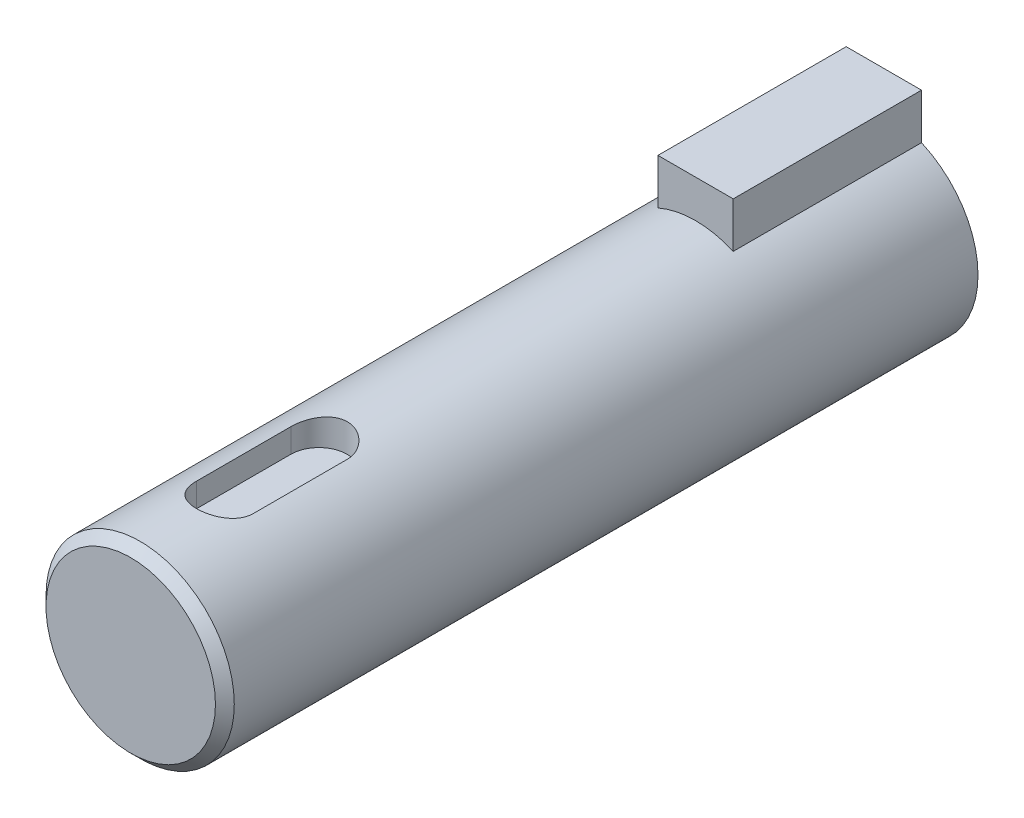
ISO-10303-21;
HEADER;
FILE_DESCRIPTION(('STEP AP214'),'2;1');
FILE_NAME('part.step','',(''),(''),'','','');
FILE_SCHEMA(('AUTOMOTIVE_DESIGN { 1 0 10303 214 1 1 1 1 }'));
ENDSEC;
DATA;
#1=APPLICATION_CONTEXT('core data for automotive mechanical design processes');
#2=APPLICATION_PROTOCOL_DEFINITION('international standard','automotive_design',2000,#1);
#3=PRODUCT_CONTEXT('',#1,'mechanical');
#4=PRODUCT('Part','Part','',(#3));
#5=PRODUCT_RELATED_PRODUCT_CATEGORY('part','',(#4));
#6=PRODUCT_DEFINITION_FORMATION('','',#4);
#7=PRODUCT_DEFINITION_CONTEXT('part definition',#1,'design');
#8=PRODUCT_DEFINITION('design','',#6,#7);
#9=PRODUCT_DEFINITION_SHAPE('','',#8);
#10=(LENGTH_UNIT() NAMED_UNIT(*) SI_UNIT(.MILLI.,.METRE.));
#11=(NAMED_UNIT(*) PLANE_ANGLE_UNIT() SI_UNIT($,.RADIAN.));
#12=(NAMED_UNIT(*) SI_UNIT($,.STERADIAN.) SOLID_ANGLE_UNIT());
#13=UNCERTAINTY_MEASURE_WITH_UNIT(LENGTH_MEASURE(1.E-05),#10,'distance_accuracy_value','');
#14=(GEOMETRIC_REPRESENTATION_CONTEXT(3) GLOBAL_UNCERTAINTY_ASSIGNED_CONTEXT((#13)) GLOBAL_UNIT_ASSIGNED_CONTEXT((#10,
#11,#12)) REPRESENTATION_CONTEXT('',''));
#15=CARTESIAN_POINT('',(0.,0.,0.));
#16=DIRECTION('',(0.,0.,1.));
#17=DIRECTION('',(1.,0.,0.));
#18=AXIS2_PLACEMENT_3D('',#15,#16,#17);
#19=CARTESIAN_POINT('',(0.,0.,10.));
#20=DIRECTION('',(0.,0.,-1.));
#21=DIRECTION('',(-1.,0.,0.));
#22=AXIS2_PLACEMENT_3D('',#19,#20,#21);
#23=CYLINDRICAL_SURFACE('',#22,5.);
#24=CARTESIAN_POINT('',(0.,0.,39.5));
#25=DIRECTION('',(0.,0.,1.));
#26=DIRECTION('',(1.,0.,0.));
#27=AXIS2_PLACEMENT_3D('',#24,#25,#26);
#28=CIRCLE('',#27,5.);
#29=CARTESIAN_POINT('',(5.,0.,39.5));
#30=VERTEX_POINT('',#29);
#31=EDGE_CURVE('E11',#30,#30,#28,.F.);
#32=ORIENTED_EDGE('',*,*,#31,.T.);
#33=EDGE_LOOP('',(#32));
#34=FACE_BOUND('',#33,.T.);
#35=CARTESIAN_POINT('',(0.,0.,0.));
#36=DIRECTION('',(0.,0.,1.));
#37=DIRECTION('',(1.,0.,0.));
#38=AXIS2_PLACEMENT_3D('',#35,#36,#37);
#39=CIRCLE('',#38,5.);
#40=CARTESIAN_POINT('',(-2.,4.58257569495584,0.));
#41=VERTEX_POINT('',#40);
#42=CARTESIAN_POINT('',(2.,4.58257569495584,0.));
#43=VERTEX_POINT('',#42);
#44=EDGE_CURVE('E172',#41,#43,#39,.T.);
#45=ORIENTED_EDGE('',*,*,#44,.T.);
#46=DIRECTION('',(0.,0.,-1.));
#47=VECTOR('',#46,1.);
#48=CARTESIAN_POINT('',(2.,4.58257569495584,10.));
#49=LINE('',#48,#47);
#50=CARTESIAN_POINT('',(2.,4.58257569495584,10.));
#51=VERTEX_POINT('',#50);
#52=EDGE_CURVE('E187',#51,#43,#49,.T.);
#53=ORIENTED_EDGE('',*,*,#52,.F.);
#54=CARTESIAN_POINT('',(0.,0.,10.));
#55=DIRECTION('',(0.,0.,1.));
#56=DIRECTION('',(1.,0.,0.));
#57=AXIS2_PLACEMENT_3D('',#54,#55,#56);
#58=CIRCLE('',#57,5.);
#59=CARTESIAN_POINT('',(-2.,4.58257569495584,10.));
#60=VERTEX_POINT('',#59);
#61=EDGE_CURVE('E126',#51,#60,#58,.T.);
#62=ORIENTED_EDGE('',*,*,#61,.T.);
#63=DIRECTION('',(0.,0.,-1.));
#64=VECTOR('',#63,1.);
#65=CARTESIAN_POINT('',(-2.,4.58257569495584,10.));
#66=LINE('',#65,#64);
#67=EDGE_CURVE('E89',#60,#41,#66,.T.);
#68=ORIENTED_EDGE('',*,*,#67,.T.);
#69=EDGE_LOOP('',(#45,#53,#62,#68));
#70=FACE_BOUND('',#69,.T.);
#71=CARTESIAN_POINT('',(-1.5,4.76969600708473,35.));
#72=CARTESIAN_POINT('',(-1.50000085357071,4.76969249084934,35.041179392908));
#73=CARTESIAN_POINT('',(-1.49830317083428,4.77022997000129,35.0823380431261));
#74=CARTESIAN_POINT('',(-1.49153785660317,4.77235095109998,35.1643411620956));
#75=CARTESIAN_POINT('',(-1.48647098275841,4.77393421787376,35.2051856993949));
#76=CARTESIAN_POINT('',(-1.46630203689311,4.78018490618873,35.3265905409547));
#77=CARTESIAN_POINT('',(-1.44623120413662,4.78635370384274,35.4063063904164));
#78=CARTESIAN_POINT('',(-1.39353102315626,4.80195952113208,35.5610355783859));
#79=CARTESIAN_POINT('',(-1.36090607068203,4.81139539670392,35.6360505521981));
#80=CARTESIAN_POINT('',(-1.28407841117656,4.83246571212051,35.7795966815976));
#81=CARTESIAN_POINT('',(-1.23987031651226,4.84410117434933,35.8481247997284));
#82=CARTESIAN_POINT('',(-1.13964850658326,4.86866835244721,35.9788660559971));
#83=CARTESIAN_POINT('',(-1.08333433465208,4.88162755412974,36.0408436603434));
#84=CARTESIAN_POINT('',(-0.961138919873354,4.90714811559049,36.1546355839));
#85=CARTESIAN_POINT('',(-0.895256063916348,4.91970940785249,36.2064481860031));
#86=CARTESIAN_POINT('',(-0.754109921315429,4.94333239727705,36.2994637703185));
#87=CARTESIAN_POINT('',(-0.678680819336258,4.95435770971354,36.340425180298));
#88=CARTESIAN_POINT('',(-0.521621185505772,4.97334469846208,36.4089884116182));
#89=CARTESIAN_POINT('',(-0.439992259012925,4.98130716463903,36.4365936777943));
#90=CARTESIAN_POINT('',(-0.275324697874875,4.99307639935002,36.4768797991021));
#91=CARTESIAN_POINT('',(-0.192393125294251,4.99699549276993,36.4899648579698));
#92=CARTESIAN_POINT('',(-0.0254235719980803,5.00063202022426,36.5021173413633));
#93=CARTESIAN_POINT('',(0.0586141962423634,5.00035024971471,36.5011874197002));
#94=CARTESIAN_POINT('',(0.222571599946018,4.99569602566266,36.485607091241));
#95=CARTESIAN_POINT('',(0.302537145464642,4.99145415509187,36.4713946550213));
#96=CARTESIAN_POINT('',(0.458890052102027,4.9795151369998,36.4303683647619));
#97=CARTESIAN_POINT('',(0.535277225531998,4.97181780846028,36.4035538505441));
#98=CARTESIAN_POINT('',(0.683347815892216,4.95365214926145,36.3377877783536));
#99=CARTESIAN_POINT('',(0.754966006044142,4.94315255692525,36.2986983556431));
#100=CARTESIAN_POINT('',(0.89076552957442,4.92049624651755,36.2096014099517));
#101=CARTESIAN_POINT('',(0.954945191614595,4.90833915735884,36.1595914405212));
#102=CARTESIAN_POINT('',(1.07665450541275,4.88311673571409,36.0478080119165));
#103=CARTESIAN_POINT('',(1.13383351478034,4.87003445449553,35.9856561362393));
#104=CARTESIAN_POINT('',(1.23706769492487,4.84484215114658,35.8525025765721));
#105=CARTESIAN_POINT('',(1.28311962013078,4.83273241337565,35.7814983196345));
#106=CARTESIAN_POINT('',(1.36316407240863,4.81077228795653,35.6317190715507));
#107=CARTESIAN_POINT('',(1.39703006341135,4.80094596245948,35.5528728204066));
#108=CARTESIAN_POINT('',(1.45085886004699,4.78495663653201,35.3902754960183));
#109=CARTESIAN_POINT('',(1.47084293218035,4.77878803475874,35.3065321392856));
#110=CARTESIAN_POINT('',(1.4890120359008,4.77314032325006,35.1850051109298));
#111=CARTESIAN_POINT('',(1.49313202989009,4.77185156275266,35.1481092658204));
#112=CARTESIAN_POINT('',(1.49862355614854,4.77012928611782,35.0741485209005));
#113=CARTESIAN_POINT('',(1.49999912968269,4.76969451246644,35.0370839503361));
#114=CARTESIAN_POINT('',(1.5,4.76969600708473,35.));
#115=B_SPLINE_CURVE_WITH_KNOTS('',3,(#71,#72,#73,#74,#75,#76,#77,#78,#79,#80,#81,#82,#83,#84,
#85,#86,#87,#88,#89,#90,#91,#92,#93,#94,#95,#96,#97,#98,#99,#100,#101,#102,#103,#104,#105,#106,
#107,#108,#109,#110,#111,#112,#113,#114),.UNSPECIFIED.,.F.,.F.,(4,2,2,2,2,2,2,2,2,2,2,2,2,2,2,2,
2,2,2,2,2,4),(0.,0.123459071219744,0.246890388853047,0.492911349615212,0.738846245884322,
0.984895736828089,1.23795510798803,1.49105719006936,1.74939356197455,2.00766326783256,
2.25854751319802,2.5093842528947,2.75223130012966,2.99509107067836,3.2407824256273,
3.48652887757005,3.74172568310981,3.99699683536778,4.25484698071527,4.51230123440207,
4.62365084745809,4.73483637253615),.UNSPECIFIED.);
#116=CARTESIAN_POINT('',(-1.5,4.76969600708473,35.));
#117=VERTEX_POINT('',#116);
#118=CARTESIAN_POINT('',(1.5,4.76969600708473,35.));
#119=VERTEX_POINT('',#118);
#120=EDGE_CURVE('E122',#117,#119,#115,.T.);
#121=ORIENTED_EDGE('',*,*,#120,.F.);
#122=DIRECTION('',(0.,0.,-1.));
#123=VECTOR('',#122,1.);
#124=CARTESIAN_POINT('',(-1.5,4.76969600708473,10.));
#125=LINE('',#124,#123);
#126=CARTESIAN_POINT('',(-1.5,4.76969600708473,30.));
#127=VERTEX_POINT('',#126);
#128=EDGE_CURVE('E193',#127,#117,#125,.F.);
#129=ORIENTED_EDGE('',*,*,#128,.F.);
#130=CARTESIAN_POINT('',(1.5,4.76969600708473,30.));
#131=CARTESIAN_POINT('',(1.50000085357071,4.76969249084934,29.958820607092));
#132=CARTESIAN_POINT('',(1.49830317083428,4.77022997000129,29.9176619568739));
#133=CARTESIAN_POINT('',(1.49153785660317,4.77235095109998,29.8356588379044));
#134=CARTESIAN_POINT('',(1.48647098275841,4.77393421787376,29.7948143006051));
#135=CARTESIAN_POINT('',(1.46630203689311,4.78018490618873,29.6734094590453));
#136=CARTESIAN_POINT('',(1.44623120413662,4.78635370384274,29.5936936095836));
#137=CARTESIAN_POINT('',(1.39353102315626,4.80195952113208,29.4389644216141));
#138=CARTESIAN_POINT('',(1.36090607068203,4.81139539670393,29.3639494478019));
#139=CARTESIAN_POINT('',(1.28407841117655,4.83246571212052,29.2204033184024));
#140=CARTESIAN_POINT('',(1.23987031651226,4.84410117434933,29.1518752002716));
#141=CARTESIAN_POINT('',(1.13964850658326,4.86866835244721,29.021133944003));
#142=CARTESIAN_POINT('',(1.08333433465208,4.88162755412974,28.9591563396566));
#143=CARTESIAN_POINT('',(0.961138919873354,4.90714811559049,28.8453644161));
#144=CARTESIAN_POINT('',(0.895256063916348,4.91970940785249,28.7935518139969));
#145=CARTESIAN_POINT('',(0.75410992131543,4.94333239727705,28.7005362296815));
#146=CARTESIAN_POINT('',(0.678680819336259,4.95435770971354,28.6595748197021));
#147=CARTESIAN_POINT('',(0.521621185505774,4.97334469846208,28.5910115883818));
#148=CARTESIAN_POINT('',(0.439992259012927,4.98130716463903,28.5634063222057));
#149=CARTESIAN_POINT('',(0.275324697874877,4.99307639935002,28.523120200898));
#150=CARTESIAN_POINT('',(0.192393125294253,4.99699549276993,28.5100351420303));
#151=CARTESIAN_POINT('',(0.0254235719980812,5.00063202022426,28.4978826586367));
#152=CARTESIAN_POINT('',(-0.058614196242363,5.00035024971471,28.4988125802998));
#153=CARTESIAN_POINT('',(-0.222571599946017,4.99569602566266,28.514392908759));
#154=CARTESIAN_POINT('',(-0.302537145464641,4.99145415509187,28.5286053449787));
#155=CARTESIAN_POINT('',(-0.458890052102026,4.9795151369998,28.5696316352381));
#156=CARTESIAN_POINT('',(-0.535277225531999,4.97181780846028,28.5964461494559));
#157=CARTESIAN_POINT('',(-0.683347815892217,4.95365214926145,28.6622122216464));
#158=CARTESIAN_POINT('',(-0.754966006044143,4.94315255692525,28.7013016443569));
#159=CARTESIAN_POINT('',(-0.890765529574421,4.92049624651755,28.7903985900483));
#160=CARTESIAN_POINT('',(-0.954945191614596,4.90833915735884,28.8404085594788));
#161=CARTESIAN_POINT('',(-1.07665450541275,4.88311673571409,28.9521919880835));
#162=CARTESIAN_POINT('',(-1.13383351478034,4.87003445449553,29.0143438637607));
#163=CARTESIAN_POINT('',(-1.23706769492487,4.84484215114658,29.1474974234279));
#164=CARTESIAN_POINT('',(-1.28311962013078,4.83273241337565,29.2185016803655));
#165=CARTESIAN_POINT('',(-1.36316407240863,4.81077228795653,29.3682809284493));
#166=CARTESIAN_POINT('',(-1.39703006341135,4.80094596245948,29.4471271795934));
#167=CARTESIAN_POINT('',(-1.45085886004699,4.78495663653201,29.6097245039817));
#168=CARTESIAN_POINT('',(-1.47084293218035,4.77878803475874,29.6934678607144));
#169=CARTESIAN_POINT('',(-1.4890120359008,4.77314032325006,29.8149948890702));
#170=CARTESIAN_POINT('',(-1.49313202989009,4.77185156275266,29.8518907341796));
#171=CARTESIAN_POINT('',(-1.49862355614854,4.77012928611782,29.9258514790995));
#172=CARTESIAN_POINT('',(-1.49999912968269,4.76969451246644,29.9629160496639));
#173=CARTESIAN_POINT('',(-1.5,4.76969600708473,30.));
#174=B_SPLINE_CURVE_WITH_KNOTS('',3,(#130,#131,#132,#133,#134,#135,#136,#137,#138,#139,#140,
#141,#142,#143,#144,#145,#146,#147,#148,#149,#150,#151,#152,#153,#154,#155,#156,#157,#158,#159,
#160,#161,#162,#163,#164,#165,#166,#167,#168,#169,#170,#171,#172,#173),.UNSPECIFIED.,.F.,.F.,(4,
2,2,2,2,2,2,2,2,2,2,2,2,2,2,2,2,2,2,2,2,4),(0.,0.123459071219737,0.246890388853047,
0.492911349615212,0.73884624588433,0.984895736828095,1.23795510798803,1.49105719006936,
1.74939356197455,2.00766326783256,2.25854751319802,2.5093842528947,2.75223130012966,
2.99509107067836,3.2407824256273,3.48652887757005,3.74172568310981,3.99699683536777,
4.25484698071527,4.51230123440207,4.62365084745809,4.73483637253615),.UNSPECIFIED.);
#175=CARTESIAN_POINT('',(1.5,4.76969600708473,30.));
#176=VERTEX_POINT('',#175);
#177=EDGE_CURVE('E196',#176,#127,#174,.T.);
#178=ORIENTED_EDGE('',*,*,#177,.F.);
#179=DIRECTION('',(0.,0.,-1.));
#180=VECTOR('',#179,1.);
#181=CARTESIAN_POINT('',(1.5,4.76969600708473,10.));
#182=LINE('',#181,#180);
#183=EDGE_CURVE('E205',#119,#176,#182,.T.);
#184=ORIENTED_EDGE('',*,*,#183,.F.);
#185=EDGE_LOOP('',(#121,#129,#178,#184));
#186=FACE_BOUND('',#185,.T.);
#187=ADVANCED_FACE('F43',(#34,#70,#186),#23,.T.);
#188=CARTESIAN_POINT('',(-2.,0.,10.));
#189=DIRECTION('',(-1.,0.,0.));
#190=DIRECTION('',(0.,0.,1.));
#191=AXIS2_PLACEMENT_3D('',#188,#189,#190);
#192=PLANE('',#191);
#193=DIRECTION('',(0.,1.,0.));
#194=VECTOR('',#193,1.);
#195=CARTESIAN_POINT('',(-2.,0.,0.));
#196=LINE('',#195,#194);
#197=CARTESIAN_POINT('',(-2.,7.,0.));
#198=VERTEX_POINT('',#197);
#199=EDGE_CURVE('E159',#41,#198,#196,.T.);
#200=ORIENTED_EDGE('',*,*,#199,.F.);
#201=ORIENTED_EDGE('',*,*,#67,.F.);
#202=DIRECTION('',(0.,1.,0.));
#203=VECTOR('',#202,1.);
#204=CARTESIAN_POINT('',(-2.,0.,10.));
#205=LINE('',#204,#203);
#206=CARTESIAN_POINT('',(-2.,7.,10.));
#207=VERTEX_POINT('',#206);
#208=EDGE_CURVE('E160',#60,#207,#205,.T.);
#209=ORIENTED_EDGE('',*,*,#208,.T.);
#210=DIRECTION('',(0.,0.,-1.));
#211=VECTOR('',#210,1.);
#212=CARTESIAN_POINT('',(-2.,7.,10.));
#213=LINE('',#212,#211);
#214=EDGE_CURVE('E68',#207,#198,#213,.T.);
#215=ORIENTED_EDGE('',*,*,#214,.T.);
#216=EDGE_LOOP('',(#200,#201,#209,#215));
#217=FACE_BOUND('',#216,.T.);
#218=ADVANCED_FACE('F241',(#217),#192,.T.);
#219=CARTESIAN_POINT('',(2.,0.,10.));
#220=DIRECTION('',(-1.,0.,0.));
#221=DIRECTION('',(0.,0.,1.));
#222=AXIS2_PLACEMENT_3D('',#219,#220,#221);
#223=PLANE('',#222);
#224=DIRECTION('',(0.,1.,0.));
#225=VECTOR('',#224,1.);
#226=CARTESIAN_POINT('',(2.,0.,0.));
#227=LINE('',#226,#225);
#228=CARTESIAN_POINT('',(2.,7.,0.));
#229=VERTEX_POINT('',#228);
#230=EDGE_CURVE('E175',#43,#229,#227,.T.);
#231=ORIENTED_EDGE('',*,*,#230,.T.);
#232=DIRECTION('',(0.,0.,-1.));
#233=VECTOR('',#232,1.);
#234=CARTESIAN_POINT('',(2.,7.,10.));
#235=LINE('',#234,#233);
#236=CARTESIAN_POINT('',(2.,7.,10.));
#237=VERTEX_POINT('',#236);
#238=EDGE_CURVE('E184',#237,#229,#235,.T.);
#239=ORIENTED_EDGE('',*,*,#238,.F.);
#240=DIRECTION('',(0.,1.,0.));
#241=VECTOR('',#240,1.);
#242=CARTESIAN_POINT('',(2.,0.,10.));
#243=LINE('',#242,#241);
#244=EDGE_CURVE('E163',#51,#237,#243,.T.);
#245=ORIENTED_EDGE('',*,*,#244,.F.);
#246=ORIENTED_EDGE('',*,*,#52,.T.);
#247=EDGE_LOOP('',(#231,#239,#245,#246));
#248=FACE_BOUND('',#247,.T.);
#249=ADVANCED_FACE('F246',(#248),#223,.F.);
#250=CARTESIAN_POINT('',(0.,7.,10.));
#251=DIRECTION('',(0.,1.,0.));
#252=DIRECTION('',(0.,0.,1.));
#253=AXIS2_PLACEMENT_3D('',#250,#251,#252);
#254=PLANE('',#253);
#255=DIRECTION('',(1.,0.,0.));
#256=VECTOR('',#255,1.);
#257=CARTESIAN_POINT('',(0.,7.,0.));
#258=LINE('',#257,#256);
#259=EDGE_CURVE('E164',#198,#229,#258,.T.);
#260=ORIENTED_EDGE('',*,*,#259,.F.);
#261=ORIENTED_EDGE('',*,*,#214,.F.);
#262=DIRECTION('',(1.,0.,0.));
#263=VECTOR('',#262,1.);
#264=CARTESIAN_POINT('',(0.,7.,10.));
#265=LINE('',#264,#263);
#266=EDGE_CURVE('E167',#207,#237,#265,.T.);
#267=ORIENTED_EDGE('',*,*,#266,.T.);
#268=ORIENTED_EDGE('',*,*,#238,.T.);
#269=EDGE_LOOP('',(#260,#261,#267,#268));
#270=FACE_BOUND('',#269,.T.);
#271=ADVANCED_FACE('F312',(#270),#254,.T.);
#272=CARTESIAN_POINT('',(0.,0.,10.));
#273=DIRECTION('',(0.,0.,1.));
#274=DIRECTION('',(1.,0.,0.));
#275=AXIS2_PLACEMENT_3D('',#272,#273,#274);
#276=PLANE('',#275);
#277=ORIENTED_EDGE('',*,*,#61,.F.);
#278=ORIENTED_EDGE('',*,*,#244,.T.);
#279=ORIENTED_EDGE('',*,*,#266,.F.);
#280=ORIENTED_EDGE('',*,*,#208,.F.);
#281=EDGE_LOOP('',(#277,#278,#279,#280));
#282=FACE_BOUND('',#281,.T.);
#283=ADVANCED_FACE('F308',(#282),#276,.T.);
#284=CARTESIAN_POINT('',(0.,0.,0.));
#285=DIRECTION('',(0.,0.,1.));
#286=DIRECTION('',(1.,0.,0.));
#287=AXIS2_PLACEMENT_3D('',#284,#285,#286);
#288=PLANE('',#287);
#289=ORIENTED_EDGE('',*,*,#199,.T.);
#290=ORIENTED_EDGE('',*,*,#259,.T.);
#291=ORIENTED_EDGE('',*,*,#230,.F.);
#292=ORIENTED_EDGE('',*,*,#44,.F.);
#293=EDGE_LOOP('',(#289,#290,#291,#292));
#294=FACE_BOUND('',#293,.T.);
#295=ADVANCED_FACE('F278',(#294),#288,.F.);
#296=CARTESIAN_POINT('',(0.,0.,40.));
#297=DIRECTION('',(0.,0.,1.));
#298=DIRECTION('',(1.,0.,0.));
#299=AXIS2_PLACEMENT_3D('',#296,#297,#298);
#300=PLANE('',#299);
#301=CARTESIAN_POINT('',(0.,0.,40.));
#302=DIRECTION('',(0.,0.,1.));
#303=DIRECTION('',(1.,0.,0.));
#304=AXIS2_PLACEMENT_3D('',#301,#302,#303);
#305=CIRCLE('',#304,4.5);
#306=CARTESIAN_POINT('',(4.5,0.,40.));
#307=VERTEX_POINT('',#306);
#308=EDGE_CURVE('E52',#307,#307,#305,.T.);
#309=ORIENTED_EDGE('',*,*,#308,.T.);
#310=EDGE_LOOP('',(#309));
#311=FACE_BOUND('',#310,.T.);
#312=ADVANCED_FACE('F222',(#311),#300,.T.);
#313=CARTESIAN_POINT('',(0.,7.,35.));
#314=DIRECTION('',(0.,-1.,0.));
#315=DIRECTION('',(0.,0.,-1.));
#316=AXIS2_PLACEMENT_3D('',#313,#314,#315);
#317=CYLINDRICAL_SURFACE('',#316,1.5);
#318=ORIENTED_EDGE('',*,*,#120,.T.);
#319=DIRECTION('',(0.,-1.,0.));
#320=VECTOR('',#319,1.);
#321=CARTESIAN_POINT('',(1.5,7.,35.));
#322=LINE('',#321,#320);
#323=CARTESIAN_POINT('',(1.5,3.5,35.));
#324=VERTEX_POINT('',#323);
#325=EDGE_CURVE('E115',#119,#324,#322,.T.);
#326=ORIENTED_EDGE('',*,*,#325,.T.);
#327=CARTESIAN_POINT('',(0.,3.5,35.));
#328=DIRECTION('',(0.,1.,0.));
#329=DIRECTION('',(0.,0.,1.));
#330=AXIS2_PLACEMENT_3D('',#327,#328,#329);
#331=CIRCLE('',#330,1.5);
#332=CARTESIAN_POINT('',(-1.5,3.5,35.));
#333=VERTEX_POINT('',#332);
#334=EDGE_CURVE('E120',#333,#324,#331,.T.);
#335=ORIENTED_EDGE('',*,*,#334,.F.);
#336=DIRECTION('',(0.,-1.,0.));
#337=VECTOR('',#336,1.);
#338=CARTESIAN_POINT('',(-1.5,7.,35.));
#339=LINE('',#338,#337);
#340=EDGE_CURVE('E149',#117,#333,#339,.T.);
#341=ORIENTED_EDGE('',*,*,#340,.F.);
#342=EDGE_LOOP('',(#318,#326,#335,#341));
#343=FACE_BOUND('',#342,.T.);
#344=ADVANCED_FACE('F117',(#343),#317,.F.);
#345=CARTESIAN_POINT('',(1.5,7.,35.));
#346=DIRECTION('',(-1.,0.,0.));
#347=DIRECTION('',(0.,0.,1.));
#348=AXIS2_PLACEMENT_3D('',#345,#346,#347);
#349=PLANE('',#348);
#350=ORIENTED_EDGE('',*,*,#183,.T.);
#351=DIRECTION('',(0.,-1.,0.));
#352=VECTOR('',#351,1.);
#353=CARTESIAN_POINT('',(1.5,7.,30.));
#354=LINE('',#353,#352);
#355=CARTESIAN_POINT('',(1.5,3.5,30.));
#356=VERTEX_POINT('',#355);
#357=EDGE_CURVE('E127',#176,#356,#354,.T.);
#358=ORIENTED_EDGE('',*,*,#357,.T.);
#359=DIRECTION('',(0.,0.,-1.));
#360=VECTOR('',#359,1.);
#361=CARTESIAN_POINT('',(1.5,3.5,35.));
#362=LINE('',#361,#360);
#363=EDGE_CURVE('E130',#324,#356,#362,.T.);
#364=ORIENTED_EDGE('',*,*,#363,.F.);
#365=ORIENTED_EDGE('',*,*,#325,.F.);
#366=EDGE_LOOP('',(#350,#358,#364,#365));
#367=FACE_BOUND('',#366,.T.);
#368=ADVANCED_FACE('F131',(#367),#349,.T.);
#369=CARTESIAN_POINT('',(0.,7.,30.));
#370=DIRECTION('',(0.,-1.,0.));
#371=DIRECTION('',(0.,0.,-1.));
#372=AXIS2_PLACEMENT_3D('',#369,#370,#371);
#373=CYLINDRICAL_SURFACE('',#372,1.5);
#374=ORIENTED_EDGE('',*,*,#177,.T.);
#375=DIRECTION('',(0.,-1.,0.));
#376=VECTOR('',#375,1.);
#377=CARTESIAN_POINT('',(-1.5,7.,30.));
#378=LINE('',#377,#376);
#379=CARTESIAN_POINT('',(-1.5,3.5,30.));
#380=VERTEX_POINT('',#379);
#381=EDGE_CURVE('E59',#127,#380,#378,.T.);
#382=ORIENTED_EDGE('',*,*,#381,.T.);
#383=CARTESIAN_POINT('',(0.,3.5,30.));
#384=DIRECTION('',(0.,1.,0.));
#385=DIRECTION('',(0.,0.,1.));
#386=AXIS2_PLACEMENT_3D('',#383,#384,#385);
#387=CIRCLE('',#386,1.5);
#388=EDGE_CURVE('E137',#356,#380,#387,.T.);
#389=ORIENTED_EDGE('',*,*,#388,.F.);
#390=ORIENTED_EDGE('',*,*,#357,.F.);
#391=EDGE_LOOP('',(#374,#382,#389,#390));
#392=FACE_BOUND('',#391,.T.);
#393=ADVANCED_FACE('F209',(#392),#373,.F.);
#394=CARTESIAN_POINT('',(-1.5,7.,35.));
#395=DIRECTION('',(1.,0.,0.));
#396=DIRECTION('',(0.,0.,-1.));
#397=AXIS2_PLACEMENT_3D('',#394,#395,#396);
#398=PLANE('',#397);
#399=ORIENTED_EDGE('',*,*,#128,.T.);
#400=ORIENTED_EDGE('',*,*,#340,.T.);
#401=DIRECTION('',(0.,0.,1.));
#402=VECTOR('',#401,1.);
#403=CARTESIAN_POINT('',(-1.5,3.5,35.));
#404=LINE('',#403,#402);
#405=EDGE_CURVE('E141',#380,#333,#404,.T.);
#406=ORIENTED_EDGE('',*,*,#405,.F.);
#407=ORIENTED_EDGE('',*,*,#381,.F.);
#408=EDGE_LOOP('',(#399,#400,#406,#407));
#409=FACE_BOUND('',#408,.T.);
#410=ADVANCED_FACE('F214',(#409),#398,.T.);
#411=CARTESIAN_POINT('',(0.,3.5,35.));
#412=DIRECTION('',(0.,1.,0.));
#413=DIRECTION('',(0.,0.,1.));
#414=AXIS2_PLACEMENT_3D('',#411,#412,#413);
#415=PLANE('',#414);
#416=ORIENTED_EDGE('',*,*,#334,.T.);
#417=ORIENTED_EDGE('',*,*,#363,.T.);
#418=ORIENTED_EDGE('',*,*,#388,.T.);
#419=ORIENTED_EDGE('',*,*,#405,.T.);
#420=EDGE_LOOP('',(#416,#417,#418,#419));
#421=FACE_BOUND('',#420,.T.);
#422=ADVANCED_FACE('F140',(#421),#415,.T.);
#423=CARTESIAN_POINT('',(0.,0.,40.));
#424=DIRECTION('',(0.,0.,-1.));
#425=DIRECTION('',(-1.,0.,0.));
#426=AXIS2_PLACEMENT_3D('',#423,#424,#425);
#427=CONICAL_SURFACE('',#426,4.5,0.785398163397442);
#428=ORIENTED_EDGE('',*,*,#31,.F.);
#429=EDGE_LOOP('',(#428));
#430=FACE_BOUND('',#429,.T.);
#431=ORIENTED_EDGE('',*,*,#308,.F.);
#432=EDGE_LOOP('',(#431));
#433=FACE_BOUND('',#432,.T.);
#434=ADVANCED_FACE('F45',(#430,#433),#427,.T.);
#435=CLOSED_SHELL('',(#187,#218,#249,#271,#283,#295,#312,#344,#368,#393,#410,#422,#434));
#436=MANIFOLD_SOLID_BREP('B2',#435);
#437=ADVANCED_BREP_SHAPE_REPRESENTATION('',(#18,#436),#14);
#438=SHAPE_DEFINITION_REPRESENTATION(#9,#437);
ENDSEC;
END-ISO-10303-21;
